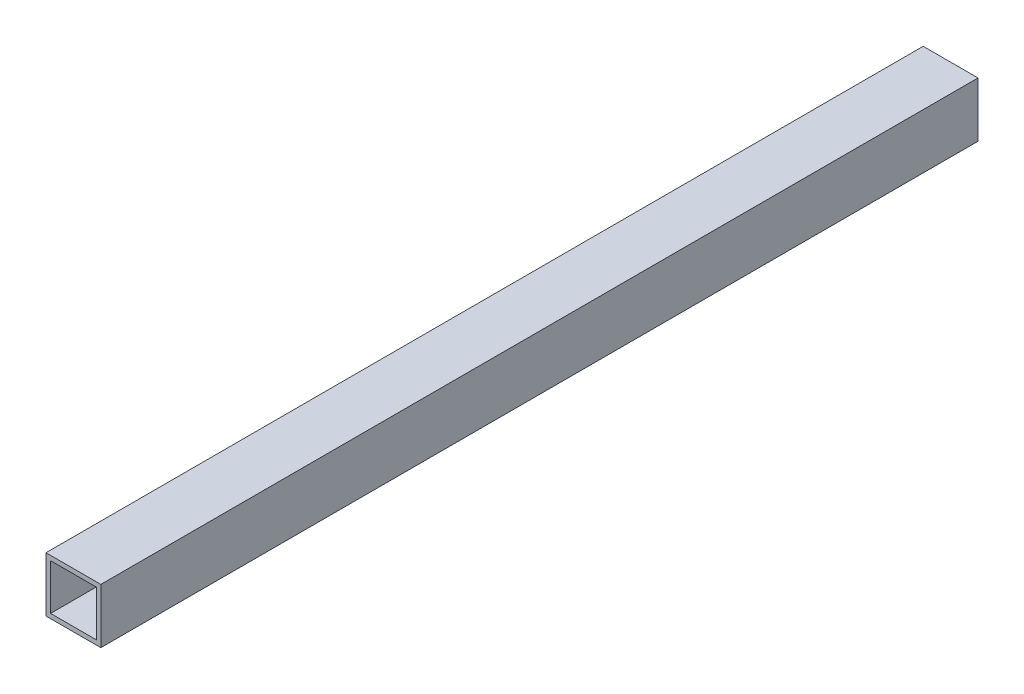
ISO-10303-21;
HEADER;
FILE_DESCRIPTION(('STEP AP214'),'2;1');
FILE_NAME('part.step','',(''),(''),'','','');
FILE_SCHEMA(('AUTOMOTIVE_DESIGN { 1 0 10303 214 1 1 1 1 }'));
ENDSEC;
DATA;
#1=APPLICATION_CONTEXT('core data for automotive mechanical design processes');
#2=APPLICATION_PROTOCOL_DEFINITION('international standard','automotive_design',2000,#1);
#3=PRODUCT_CONTEXT('',#1,'mechanical');
#4=PRODUCT('Part','Part','',(#3));
#5=PRODUCT_RELATED_PRODUCT_CATEGORY('part','',(#4));
#6=PRODUCT_DEFINITION_FORMATION('','',#4);
#7=PRODUCT_DEFINITION_CONTEXT('part definition',#1,'design');
#8=PRODUCT_DEFINITION('design','',#6,#7);
#9=PRODUCT_DEFINITION_SHAPE('','',#8);
#10=(LENGTH_UNIT() NAMED_UNIT(*) SI_UNIT(.MILLI.,.METRE.));
#11=(NAMED_UNIT(*) PLANE_ANGLE_UNIT() SI_UNIT($,.RADIAN.));
#12=(NAMED_UNIT(*) SI_UNIT($,.STERADIAN.) SOLID_ANGLE_UNIT());
#13=UNCERTAINTY_MEASURE_WITH_UNIT(LENGTH_MEASURE(1.E-05),#10,'distance_accuracy_value','');
#14=(GEOMETRIC_REPRESENTATION_CONTEXT(3) GLOBAL_UNCERTAINTY_ASSIGNED_CONTEXT((#13)) GLOBAL_UNIT_ASSIGNED_CONTEXT((#10,
#11,#12)) REPRESENTATION_CONTEXT('',''));
#15=CARTESIAN_POINT('',(0.,0.,0.));
#16=DIRECTION('',(0.,0.,1.));
#17=DIRECTION('',(1.,0.,0.));
#18=AXIS2_PLACEMENT_3D('',#15,#16,#17);
#19=CARTESIAN_POINT('',(0.,0.,-240.));
#20=DIRECTION('',(0.,0.,-1.));
#21=DIRECTION('',(-1.,0.,0.));
#22=AXIS2_PLACEMENT_3D('',#19,#20,#21);
#23=PLANE('',#22);
#24=DIRECTION('',(-1.,0.,0.));
#25=VECTOR('',#24,1.);
#26=CARTESIAN_POINT('',(-12.5,12.5,-240.));
#27=LINE('',#26,#25);
#28=CARTESIAN_POINT('',(12.5,12.5,-240.));
#29=VERTEX_POINT('',#28);
#30=CARTESIAN_POINT('',(-12.5,12.5,-240.));
#31=VERTEX_POINT('',#30);
#32=EDGE_CURVE('E139',#29,#31,#27,.T.);
#33=ORIENTED_EDGE('',*,*,#32,.T.);
#34=DIRECTION('',(0.,-1.,0.));
#35=VECTOR('',#34,1.);
#36=CARTESIAN_POINT('',(-12.5,-12.5,-240.));
#37=LINE('',#36,#35);
#38=CARTESIAN_POINT('',(-12.5,-12.5,-240.));
#39=VERTEX_POINT('',#38);
#40=EDGE_CURVE('E140',#31,#39,#37,.T.);
#41=ORIENTED_EDGE('',*,*,#40,.T.);
#42=DIRECTION('',(1.,0.,0.));
#43=VECTOR('',#42,1.);
#44=CARTESIAN_POINT('',(12.5,-12.5,-240.));
#45=LINE('',#44,#43);
#46=CARTESIAN_POINT('',(12.5,-12.5,-240.));
#47=VERTEX_POINT('',#46);
#48=EDGE_CURVE('E104',#39,#47,#45,.T.);
#49=ORIENTED_EDGE('',*,*,#48,.T.);
#50=DIRECTION('',(0.,1.,0.));
#51=VECTOR('',#50,1.);
#52=CARTESIAN_POINT('',(12.5,12.5,-240.));
#53=LINE('',#52,#51);
#54=EDGE_CURVE('E102',#47,#29,#53,.T.);
#55=ORIENTED_EDGE('',*,*,#54,.T.);
#56=EDGE_LOOP('',(#33,#41,#49,#55));
#57=FACE_BOUND('',#56,.T.);
#58=DIRECTION('',(0.,-1.,0.));
#59=VECTOR('',#58,1.);
#60=CARTESIAN_POINT('',(15.,-15.,-240.));
#61=LINE('',#60,#59);
#62=CARTESIAN_POINT('',(15.,15.,-240.));
#63=VERTEX_POINT('',#62);
#64=CARTESIAN_POINT('',(15.,-15.,-240.));
#65=VERTEX_POINT('',#64);
#66=EDGE_CURVE('E11',#63,#65,#61,.T.);
#67=ORIENTED_EDGE('',*,*,#66,.T.);
#68=DIRECTION('',(-1.,0.,0.));
#69=VECTOR('',#68,1.);
#70=CARTESIAN_POINT('',(-15.,-15.,-240.));
#71=LINE('',#70,#69);
#72=CARTESIAN_POINT('',(-15.,-15.,-240.));
#73=VERTEX_POINT('',#72);
#74=EDGE_CURVE('E159',#65,#73,#71,.T.);
#75=ORIENTED_EDGE('',*,*,#74,.T.);
#76=DIRECTION('',(0.,1.,0.));
#77=VECTOR('',#76,1.);
#78=CARTESIAN_POINT('',(-15.,15.,-240.));
#79=LINE('',#78,#77);
#80=CARTESIAN_POINT('',(-15.,15.,-240.));
#81=VERTEX_POINT('',#80);
#82=EDGE_CURVE('E146',#73,#81,#79,.T.);
#83=ORIENTED_EDGE('',*,*,#82,.T.);
#84=DIRECTION('',(1.,0.,0.));
#85=VECTOR('',#84,1.);
#86=CARTESIAN_POINT('',(15.,15.,-240.));
#87=LINE('',#86,#85);
#88=EDGE_CURVE('E154',#81,#63,#87,.T.);
#89=ORIENTED_EDGE('',*,*,#88,.T.);
#90=EDGE_LOOP('',(#67,#75,#83,#89));
#91=FACE_BOUND('',#90,.T.);
#92=ADVANCED_FACE('F16',(#57,#91),#23,.T.);
#93=CARTESIAN_POINT('',(15.,15.,0.));
#94=DIRECTION('',(1.,0.,0.));
#95=DIRECTION('',(0.,-1.,0.));
#96=AXIS2_PLACEMENT_3D('',#93,#94,#95);
#97=PLANE('',#96);
#98=DIRECTION('',(0.,0.,-1.));
#99=VECTOR('',#98,1.);
#100=CARTESIAN_POINT('',(15.,-15.,0.));
#101=LINE('',#100,#99);
#102=CARTESIAN_POINT('',(15.,-15.,240.));
#103=VERTEX_POINT('',#102);
#104=EDGE_CURVE('E27',#103,#65,#101,.T.);
#105=ORIENTED_EDGE('',*,*,#104,.T.);
#106=ORIENTED_EDGE('',*,*,#66,.F.);
#107=DIRECTION('',(0.,0.,1.));
#108=VECTOR('',#107,1.);
#109=CARTESIAN_POINT('',(15.,15.,0.));
#110=LINE('',#109,#108);
#111=CARTESIAN_POINT('',(15.,15.,240.));
#112=VERTEX_POINT('',#111);
#113=EDGE_CURVE('E152',#63,#112,#110,.T.);
#114=ORIENTED_EDGE('',*,*,#113,.T.);
#115=DIRECTION('',(0.,1.,0.));
#116=VECTOR('',#115,1.);
#117=CARTESIAN_POINT('',(15.,-15.,240.));
#118=LINE('',#117,#116);
#119=EDGE_CURVE('E133',#103,#112,#118,.T.);
#120=ORIENTED_EDGE('',*,*,#119,.F.);
#121=EDGE_LOOP('',(#105,#106,#114,#120));
#122=FACE_BOUND('',#121,.T.);
#123=ADVANCED_FACE('F280',(#122),#97,.T.);
#124=CARTESIAN_POINT('',(15.,-15.,0.));
#125=DIRECTION('',(0.,-1.,0.));
#126=DIRECTION('',(-1.,0.,0.));
#127=AXIS2_PLACEMENT_3D('',#124,#125,#126);
#128=PLANE('',#127);
#129=DIRECTION('',(0.,0.,1.));
#130=VECTOR('',#129,1.);
#131=CARTESIAN_POINT('',(-15.,-15.,0.));
#132=LINE('',#131,#130);
#133=CARTESIAN_POINT('',(-15.,-15.,240.));
#134=VERTEX_POINT('',#133);
#135=EDGE_CURVE('E72',#73,#134,#132,.T.);
#136=ORIENTED_EDGE('',*,*,#135,.F.);
#137=ORIENTED_EDGE('',*,*,#74,.F.);
#138=ORIENTED_EDGE('',*,*,#104,.F.);
#139=DIRECTION('',(1.,0.,0.));
#140=VECTOR('',#139,1.);
#141=CARTESIAN_POINT('',(-15.,-15.,240.));
#142=LINE('',#141,#140);
#143=EDGE_CURVE('E124',#134,#103,#142,.T.);
#144=ORIENTED_EDGE('',*,*,#143,.F.);
#145=EDGE_LOOP('',(#136,#137,#138,#144));
#146=FACE_BOUND('',#145,.T.);
#147=ADVANCED_FACE('F270',(#146),#128,.T.);
#148=CARTESIAN_POINT('',(-15.,-15.,0.));
#149=DIRECTION('',(-1.,0.,0.));
#150=DIRECTION('',(0.,1.,0.));
#151=AXIS2_PLACEMENT_3D('',#148,#149,#150);
#152=PLANE('',#151);
#153=DIRECTION('',(0.,0.,1.));
#154=VECTOR('',#153,1.);
#155=CARTESIAN_POINT('',(-15.,15.,0.));
#156=LINE('',#155,#154);
#157=CARTESIAN_POINT('',(-15.,15.,240.));
#158=VERTEX_POINT('',#157);
#159=EDGE_CURVE('E20',#81,#158,#156,.T.);
#160=ORIENTED_EDGE('',*,*,#159,.F.);
#161=ORIENTED_EDGE('',*,*,#82,.F.);
#162=ORIENTED_EDGE('',*,*,#135,.T.);
#163=DIRECTION('',(0.,-1.,0.));
#164=VECTOR('',#163,1.);
#165=CARTESIAN_POINT('',(-15.,15.,240.));
#166=LINE('',#165,#164);
#167=EDGE_CURVE('E132',#158,#134,#166,.T.);
#168=ORIENTED_EDGE('',*,*,#167,.F.);
#169=EDGE_LOOP('',(#160,#161,#162,#168));
#170=FACE_BOUND('',#169,.T.);
#171=ADVANCED_FACE('F175',(#170),#152,.T.);
#172=CARTESIAN_POINT('',(-15.,15.,0.));
#173=DIRECTION('',(0.,1.,0.));
#174=DIRECTION('',(1.,0.,0.));
#175=AXIS2_PLACEMENT_3D('',#172,#173,#174);
#176=PLANE('',#175);
#177=ORIENTED_EDGE('',*,*,#113,.F.);
#178=ORIENTED_EDGE('',*,*,#88,.F.);
#179=ORIENTED_EDGE('',*,*,#159,.T.);
#180=DIRECTION('',(-1.,0.,0.));
#181=VECTOR('',#180,1.);
#182=CARTESIAN_POINT('',(15.,15.,240.));
#183=LINE('',#182,#181);
#184=EDGE_CURVE('E128',#112,#158,#183,.T.);
#185=ORIENTED_EDGE('',*,*,#184,.F.);
#186=EDGE_LOOP('',(#177,#178,#179,#185));
#187=FACE_BOUND('',#186,.T.);
#188=ADVANCED_FACE('F173',(#187),#176,.T.);
#189=CARTESIAN_POINT('',(12.5,12.5,0.));
#190=DIRECTION('',(0.,-1.,0.));
#191=DIRECTION('',(-1.,0.,0.));
#192=AXIS2_PLACEMENT_3D('',#189,#190,#191);
#193=PLANE('',#192);
#194=DIRECTION('',(0.,0.,-1.));
#195=VECTOR('',#194,1.);
#196=CARTESIAN_POINT('',(-12.5,12.5,0.));
#197=LINE('',#196,#195);
#198=CARTESIAN_POINT('',(-12.5,12.5,240.));
#199=VERTEX_POINT('',#198);
#200=EDGE_CURVE('E63',#199,#31,#197,.T.);
#201=ORIENTED_EDGE('',*,*,#200,.T.);
#202=ORIENTED_EDGE('',*,*,#32,.F.);
#203=DIRECTION('',(0.,0.,1.));
#204=VECTOR('',#203,1.);
#205=CARTESIAN_POINT('',(12.5,12.5,0.));
#206=LINE('',#205,#204);
#207=CARTESIAN_POINT('',(12.5,12.5,240.));
#208=VERTEX_POINT('',#207);
#209=EDGE_CURVE('E136',#29,#208,#206,.T.);
#210=ORIENTED_EDGE('',*,*,#209,.T.);
#211=DIRECTION('',(1.,0.,0.));
#212=VECTOR('',#211,1.);
#213=CARTESIAN_POINT('',(-12.5,12.5,240.));
#214=LINE('',#213,#212);
#215=EDGE_CURVE('E116',#199,#208,#214,.T.);
#216=ORIENTED_EDGE('',*,*,#215,.F.);
#217=EDGE_LOOP('',(#201,#202,#210,#216));
#218=FACE_BOUND('',#217,.T.);
#219=ADVANCED_FACE('F18',(#218),#193,.T.);
#220=CARTESIAN_POINT('',(-12.5,12.5,0.));
#221=DIRECTION('',(1.,0.,0.));
#222=DIRECTION('',(0.,-1.,0.));
#223=AXIS2_PLACEMENT_3D('',#220,#221,#222);
#224=PLANE('',#223);
#225=DIRECTION('',(0.,0.,1.));
#226=VECTOR('',#225,1.);
#227=CARTESIAN_POINT('',(-12.5,-12.5,0.));
#228=LINE('',#227,#226);
#229=CARTESIAN_POINT('',(-12.5,-12.5,240.));
#230=VERTEX_POINT('',#229);
#231=EDGE_CURVE('E89',#39,#230,#228,.T.);
#232=ORIENTED_EDGE('',*,*,#231,.F.);
#233=ORIENTED_EDGE('',*,*,#40,.F.);
#234=ORIENTED_EDGE('',*,*,#200,.F.);
#235=DIRECTION('',(0.,1.,0.));
#236=VECTOR('',#235,1.);
#237=CARTESIAN_POINT('',(-12.5,-12.5,240.));
#238=LINE('',#237,#236);
#239=EDGE_CURVE('E111',#230,#199,#238,.T.);
#240=ORIENTED_EDGE('',*,*,#239,.F.);
#241=EDGE_LOOP('',(#232,#233,#234,#240));
#242=FACE_BOUND('',#241,.T.);
#243=ADVANCED_FACE('F188',(#242),#224,.T.);
#244=CARTESIAN_POINT('',(-12.5,-12.5,0.));
#245=DIRECTION('',(0.,1.,0.));
#246=DIRECTION('',(1.,0.,0.));
#247=AXIS2_PLACEMENT_3D('',#244,#245,#246);
#248=PLANE('',#247);
#249=DIRECTION('',(0.,0.,1.));
#250=VECTOR('',#249,1.);
#251=CARTESIAN_POINT('',(12.5,-12.5,0.));
#252=LINE('',#251,#250);
#253=CARTESIAN_POINT('',(12.5,-12.5,240.));
#254=VERTEX_POINT('',#253);
#255=EDGE_CURVE('E95',#47,#254,#252,.T.);
#256=ORIENTED_EDGE('',*,*,#255,.F.);
#257=ORIENTED_EDGE('',*,*,#48,.F.);
#258=ORIENTED_EDGE('',*,*,#231,.T.);
#259=DIRECTION('',(-1.,0.,0.));
#260=VECTOR('',#259,1.);
#261=CARTESIAN_POINT('',(12.5,-12.5,240.));
#262=LINE('',#261,#260);
#263=EDGE_CURVE('E107',#254,#230,#262,.T.);
#264=ORIENTED_EDGE('',*,*,#263,.F.);
#265=EDGE_LOOP('',(#256,#257,#258,#264));
#266=FACE_BOUND('',#265,.T.);
#267=ADVANCED_FACE('F108',(#266),#248,.T.);
#268=CARTESIAN_POINT('',(12.5,-12.5,0.));
#269=DIRECTION('',(-1.,0.,0.));
#270=DIRECTION('',(0.,1.,0.));
#271=AXIS2_PLACEMENT_3D('',#268,#269,#270);
#272=PLANE('',#271);
#273=ORIENTED_EDGE('',*,*,#209,.F.);
#274=ORIENTED_EDGE('',*,*,#54,.F.);
#275=ORIENTED_EDGE('',*,*,#255,.T.);
#276=DIRECTION('',(0.,-1.,0.));
#277=VECTOR('',#276,1.);
#278=CARTESIAN_POINT('',(12.5,12.5,240.));
#279=LINE('',#278,#277);
#280=EDGE_CURVE('E99',#208,#254,#279,.T.);
#281=ORIENTED_EDGE('',*,*,#280,.F.);
#282=EDGE_LOOP('',(#273,#274,#275,#281));
#283=FACE_BOUND('',#282,.T.);
#284=ADVANCED_FACE('F97',(#283),#272,.T.);
#285=CARTESIAN_POINT('',(0.,0.,240.));
#286=DIRECTION('',(0.,0.,1.));
#287=DIRECTION('',(1.,0.,0.));
#288=AXIS2_PLACEMENT_3D('',#285,#286,#287);
#289=PLANE('',#288);
#290=ORIENTED_EDGE('',*,*,#215,.T.);
#291=ORIENTED_EDGE('',*,*,#280,.T.);
#292=ORIENTED_EDGE('',*,*,#263,.T.);
#293=ORIENTED_EDGE('',*,*,#239,.T.);
#294=EDGE_LOOP('',(#290,#291,#292,#293));
#295=FACE_BOUND('',#294,.T.);
#296=ORIENTED_EDGE('',*,*,#119,.T.);
#297=ORIENTED_EDGE('',*,*,#184,.T.);
#298=ORIENTED_EDGE('',*,*,#167,.T.);
#299=ORIENTED_EDGE('',*,*,#143,.T.);
#300=EDGE_LOOP('',(#296,#297,#298,#299));
#301=FACE_BOUND('',#300,.T.);
#302=ADVANCED_FACE('F113',(#295,#301),#289,.T.);
#303=CLOSED_SHELL('',(#92,#123,#147,#171,#188,#219,#243,#267,#284,#302));
#304=MANIFOLD_SOLID_BREP('B1',#303);
#305=ADVANCED_BREP_SHAPE_REPRESENTATION('',(#18,#304),#14);
#306=SHAPE_DEFINITION_REPRESENTATION(#9,#305);
ENDSEC;
END-ISO-10303-21;
